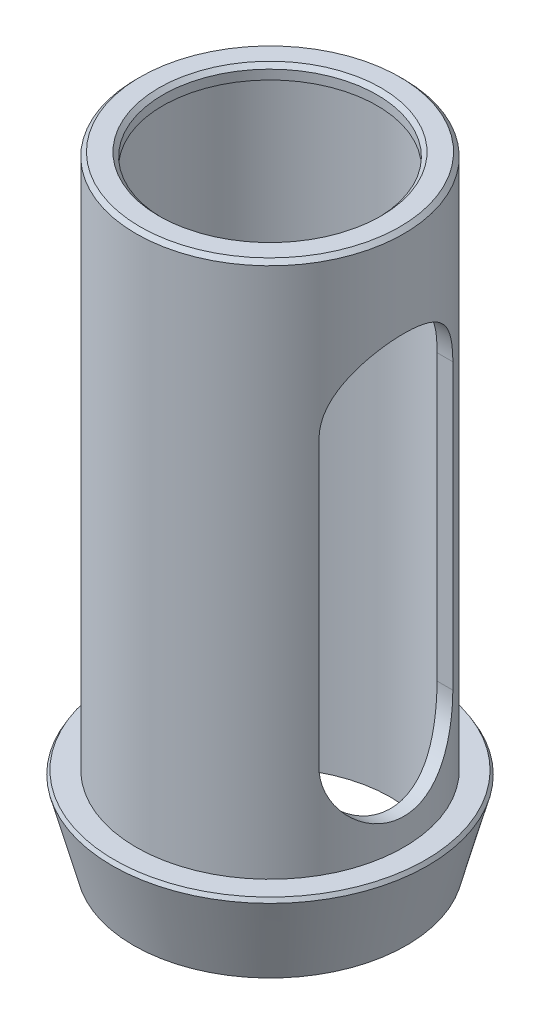
ISO-10303-21;
HEADER;
FILE_DESCRIPTION(('STEP AP214'),'2;1');
FILE_NAME('part.step','',(''),(''),'','','');
FILE_SCHEMA(('AUTOMOTIVE_DESIGN { 1 0 10303 214 1 1 1 1 }'));
ENDSEC;
DATA;
#1=APPLICATION_CONTEXT('core data for automotive mechanical design processes');
#2=APPLICATION_PROTOCOL_DEFINITION('international standard','automotive_design',2000,#1);
#3=PRODUCT_CONTEXT('',#1,'mechanical');
#4=PRODUCT('Part','Part','',(#3));
#5=PRODUCT_RELATED_PRODUCT_CATEGORY('part','',(#4));
#6=PRODUCT_DEFINITION_FORMATION('','',#4);
#7=PRODUCT_DEFINITION_CONTEXT('part definition',#1,'design');
#8=PRODUCT_DEFINITION('design','',#6,#7);
#9=PRODUCT_DEFINITION_SHAPE('','',#8);
#10=(LENGTH_UNIT() NAMED_UNIT(*) SI_UNIT(.MILLI.,.METRE.));
#11=(NAMED_UNIT(*) PLANE_ANGLE_UNIT() SI_UNIT($,.RADIAN.));
#12=(NAMED_UNIT(*) SI_UNIT($,.STERADIAN.) SOLID_ANGLE_UNIT());
#13=UNCERTAINTY_MEASURE_WITH_UNIT(LENGTH_MEASURE(1.E-05),#10,'distance_accuracy_value','');
#14=(GEOMETRIC_REPRESENTATION_CONTEXT(3) GLOBAL_UNCERTAINTY_ASSIGNED_CONTEXT((#13)) GLOBAL_UNIT_ASSIGNED_CONTEXT((#10,
#11,#12)) REPRESENTATION_CONTEXT('',''));
#15=CARTESIAN_POINT('',(0.,0.,0.));
#16=DIRECTION('',(0.,0.,1.));
#17=DIRECTION('',(1.,0.,0.));
#18=AXIS2_PLACEMENT_3D('',#15,#16,#17);
#19=CARTESIAN_POINT('',(0.,0.,0.));
#20=DIRECTION('',(0.,1.,0.));
#21=DIRECTION('',(0.,0.,1.));
#22=AXIS2_PLACEMENT_3D('',#19,#20,#21);
#23=CONICAL_SURFACE('',#22,25.908,0.26179938779915);
#24=CARTESIAN_POINT('',(0.,15.1389645203677,0.));
#25=DIRECTION('',(0.,1.,0.));
#26=DIRECTION('',(0.,0.,1.));
#27=AXIS2_PLACEMENT_3D('',#24,#25,#26);
#28=CIRCLE('',#27,29.964473317476);
#29=CARTESIAN_POINT('',(0.,15.1389645203677,-29.964473317476));
#30=VERTEX_POINT('',#29);
#31=EDGE_CURVE('E205',#30,#30,#28,.F.);
#32=ORIENTED_EDGE('',*,*,#31,.T.);
#33=EDGE_LOOP('',(#32));
#34=FACE_BOUND('',#33,.T.);
#35=CARTESIAN_POINT('',(0.,0.,0.));
#36=DIRECTION('',(0.,1.,0.));
#37=DIRECTION('',(0.,0.,1.));
#38=AXIS2_PLACEMENT_3D('',#35,#36,#37);
#39=CIRCLE('',#38,25.908);
#40=CARTESIAN_POINT('',(0.,0.,25.908));
#41=VERTEX_POINT('',#40);
#42=EDGE_CURVE('E220',#41,#41,#39,.T.);
#43=ORIENTED_EDGE('',*,*,#42,.T.);
#44=EDGE_LOOP('',(#43));
#45=FACE_BOUND('',#44,.T.);
#46=ADVANCED_FACE('F39',(#34,#45),#23,.T.);
#47=CARTESIAN_POINT('',(0.,15.875,0.));
#48=DIRECTION('',(0.,1.,0.));
#49=DIRECTION('',(0.,0.,1.));
#50=AXIS2_PLACEMENT_3D('',#47,#48,#49);
#51=PLANE('',#50);
#52=CARTESIAN_POINT('',(0.,15.875,0.));
#53=DIRECTION('',(0.,1.,0.));
#54=DIRECTION('',(0.,0.,1.));
#55=AXIS2_PLACEMENT_3D('',#52,#53,#54);
#56=CIRCLE('',#55,29.5395230351772);
#57=CARTESIAN_POINT('',(0.,15.875,-29.5395230351772));
#58=VERTEX_POINT('',#57);
#59=EDGE_CURVE('E225',#58,#58,#56,.T.);
#60=ORIENTED_EDGE('',*,*,#59,.T.);
#61=EDGE_LOOP('',(#60));
#62=FACE_BOUND('',#61,.T.);
#63=CARTESIAN_POINT('',(0.,15.875,0.));
#64=DIRECTION('',(0.,1.,0.));
#65=DIRECTION('',(0.,0.,1.));
#66=AXIS2_PLACEMENT_3D('',#63,#64,#65);
#67=CIRCLE('',#66,25.4);
#68=CARTESIAN_POINT('',(0.,15.875,25.4));
#69=VERTEX_POINT('',#68);
#70=EDGE_CURVE('E222',#69,#69,#67,.T.);
#71=ORIENTED_EDGE('',*,*,#70,.F.);
#72=EDGE_LOOP('',(#71));
#73=FACE_BOUND('',#72,.T.);
#74=ADVANCED_FACE('F142',(#62,#73),#51,.T.);
#75=CARTESIAN_POINT('',(0.,0.,0.));
#76=DIRECTION('',(0.,1.,0.));
#77=DIRECTION('',(0.,0.,1.));
#78=AXIS2_PLACEMENT_3D('',#75,#76,#77);
#79=PLANE('',#78);
#80=CARTESIAN_POINT('',(0.,0.,0.));
#81=DIRECTION('',(0.,-1.,0.));
#82=DIRECTION('',(0.,0.,-1.));
#83=AXIS2_PLACEMENT_3D('',#80,#81,#82);
#84=CIRCLE('',#83,22.86);
#85=CARTESIAN_POINT('',(0.,0.,-22.86));
#86=VERTEX_POINT('',#85);
#87=EDGE_CURVE('E213',#86,#86,#84,.T.);
#88=ORIENTED_EDGE('',*,*,#87,.F.);
#89=EDGE_LOOP('',(#88));
#90=FACE_BOUND('',#89,.T.);
#91=ORIENTED_EDGE('',*,*,#42,.F.);
#92=EDGE_LOOP('',(#91));
#93=FACE_BOUND('',#92,.T.);
#94=ADVANCED_FACE('F140',(#90,#93),#79,.F.);
#95=CARTESIAN_POINT('',(0.,117.475,0.));
#96=DIRECTION('',(0.,-1.,0.));
#97=DIRECTION('',(0.,0.,-1.));
#98=AXIS2_PLACEMENT_3D('',#95,#96,#97);
#99=CYLINDRICAL_SURFACE('',#98,25.4);
#100=DIRECTION('',(0.,-1.,0.));
#101=VECTOR('',#100,1.);
#102=CARTESIAN_POINT('',(21.9970452561247,117.475,-12.7));
#103=LINE('',#102,#101);
#104=CARTESIAN_POINT('',(21.9970452561247,87.63,-12.7));
#105=VERTEX_POINT('',#104);
#106=CARTESIAN_POINT('',(21.9970452561247,33.655,-12.7));
#107=VERTEX_POINT('',#106);
#108=EDGE_CURVE('E132',#105,#107,#103,.T.);
#109=ORIENTED_EDGE('',*,*,#108,.T.);
#110=CARTESIAN_POINT('',(21.9970452561247,33.655,-12.7));
#111=CARTESIAN_POINT('',(21.9970414396094,33.4886967395995,-12.7000012350209));
#112=CARTESIAN_POINT('',(21.9989319888934,33.3224169785993,-12.6967327347774));
#113=CARTESIAN_POINT('',(22.006462703468,32.990205447678,-12.683677781512));
#114=CARTESIAN_POINT('',(22.0121027101483,32.8242736633345,-12.6738916042023));
#115=CARTESIAN_POINT('',(22.0345757611602,32.3277118669053,-12.6348105505561));
#116=CARTESIAN_POINT('',(22.0569619679057,31.9980319961614,-12.5957930726223));
#117=CARTESIAN_POINT('',(22.1155380915001,31.3458913728344,-12.4926552461168));
#118=CARTESIAN_POINT('',(22.1516481575131,31.0234000740164,-12.4286800554354));
#119=CARTESIAN_POINT('',(22.2363984092014,30.3858645471533,-12.2764069103784));
#120=CARTESIAN_POINT('',(22.2850400340891,30.0708211790212,-12.1881061622036));
#121=CARTESIAN_POINT('',(22.3931170114,29.4508723777069,-11.9883758640728));
#122=CARTESIAN_POINT('',(22.4525284377125,29.1459462100245,-11.8769975062509));
#123=CARTESIAN_POINT('',(22.5804045585334,28.5471387835711,-11.6320421542612));
#124=CARTESIAN_POINT('',(22.6488691370672,28.253257383374,-11.4984654444575));
#125=CARTESIAN_POINT('',(22.7930331560059,27.6775298058626,-11.2099804732541));
#126=CARTESIAN_POINT('',(22.8687418055359,27.3956996250638,-11.0550449459176));
#127=CARTESIAN_POINT('',(23.0253996292901,26.8455507002946,-10.7249408659039));
#128=CARTESIAN_POINT('',(23.1063507283755,26.5772369841667,-10.5497648628401));
#129=CARTESIAN_POINT('',(23.2782885558474,26.0339477074241,-10.1650971801861));
#130=CARTESIAN_POINT('',(23.3695550628471,25.7602164200412,-9.95397156155212));
#131=CARTESIAN_POINT('',(23.5535559117077,25.2311334051046,-9.51039733322313));
#132=CARTESIAN_POINT('',(23.6462903283373,24.975782617471,-9.27794763446337));
#133=CARTESIAN_POINT('',(23.8309606049041,24.4845855602846,-8.79276468755069));
#134=CARTESIAN_POINT('',(23.9228961087944,24.2487476242533,-8.5400228629343));
#135=CARTESIAN_POINT('',(24.103671050886,23.7980451364015,-8.01560599452959));
#136=CARTESIAN_POINT('',(24.1925115183395,23.5831735685856,-7.74393733676476));
#137=CARTESIAN_POINT('',(24.3708514078877,23.161798416835,-7.16378462553701));
#138=CARTESIAN_POINT('',(24.4599862532057,22.9568527722448,-6.85405330892021));
#139=CARTESIAN_POINT('',(24.6298463592293,22.5739905425763,-6.21607806310032));
#140=CARTESIAN_POINT('',(24.7105711350025,22.3960755158378,-5.88783306806153));
#141=CARTESIAN_POINT('',(24.8612501700202,22.0691117798188,-5.21507342298949));
#142=CARTESIAN_POINT('',(24.9312095664927,21.9200492933236,-4.87056663627276));
#143=CARTESIAN_POINT('',(25.0583001324898,21.6524049207068,-4.16762566461531));
#144=CARTESIAN_POINT('',(25.1154326656043,21.5338197944235,-3.80919296485829));
#145=CARTESIAN_POINT('',(25.2115393699809,21.335964234711,-3.10720530462334));
#146=CARTESIAN_POINT('',(25.2515162644623,21.2544969238466,-2.76440621955987));
#147=CARTESIAN_POINT('',(25.3177415644942,21.1201900167496,-2.07193150973685));
#148=CARTESIAN_POINT('',(25.3439905665485,21.067349176637,-1.72225618444863));
#149=CARTESIAN_POINT('',(25.3819883248125,20.991018511182,-1.01910581528698));
#150=CARTESIAN_POINT('',(25.3937442340291,20.9675142068407,-0.665632732745787));
#151=CARTESIAN_POINT('',(25.4024303210946,20.9501375474038,0.0422142786452658));
#152=CARTESIAN_POINT('',(25.3993614058484,20.956263379692,0.396588151063987));
#153=CARTESIAN_POINT('',(25.3794054750907,20.9962293954721,1.07234709635932));
#154=CARTESIAN_POINT('',(25.3637450461772,21.0276096912033,1.39391757271056));
#155=CARTESIAN_POINT('',(25.3205396897996,21.1146188699675,2.03292949194426));
#156=CARTESIAN_POINT('',(25.2929955991071,21.1702460456928,2.35037122392562));
#157=CARTESIAN_POINT('',(25.2266832381143,21.3051420225889,2.97898616813181));
#158=CARTESIAN_POINT('',(25.1879148162447,21.384411143012,3.29015929564709));
#159=CARTESIAN_POINT('',(25.1000563890435,21.565784918051,3.9042796718663));
#160=CARTESIAN_POINT('',(25.0509660136199,21.6678903914688,4.20722662518229));
#161=CARTESIAN_POINT('',(24.9428274660593,21.8955437872797,4.80724125102716));
#162=CARTESIAN_POINT('',(24.8836515476992,22.0213949971317,5.1041706297326));
#163=CARTESIAN_POINT('',(24.7571406199773,22.2945134349376,5.68618399676862));
#164=CARTESIAN_POINT('',(24.6898056184941,22.4417806422115,5.97126799653717));
#165=CARTESIAN_POINT('',(24.5484088809431,22.7566439507374,6.5282613154405));
#166=CARTESIAN_POINT('',(24.4743464246001,22.9242422293818,6.80016921908602));
#167=CARTESIAN_POINT('',(24.3210101619422,23.2787251888179,7.32969899033001));
#168=CARTESIAN_POINT('',(24.2417343350664,23.4656173635815,7.58731524670746));
#169=CARTESIAN_POINT('',(24.0719582547907,23.876078356657,8.11070119879699));
#170=CARTESIAN_POINT('',(23.9811044919939,24.1014438435616,8.37494897323532));
#171=CARTESIAN_POINT('',(23.7973153531037,24.572639144061,8.88374730168019));
#172=CARTESIAN_POINT('',(23.7043798596802,24.8184701132581,9.12829674186609));
#173=CARTESIAN_POINT('',(23.5186440423044,25.3295373896343,9.59671363450685));
#174=CARTESIAN_POINT('',(23.4258438807355,25.5947887111984,9.82056477545915));
#175=CARTESIAN_POINT('',(23.2428119048125,26.1433317353761,10.2462378392843));
#176=CARTESIAN_POINT('',(23.1525805590904,26.4266266995812,10.4480557614082));
#177=CARTESIAN_POINT('',(22.9714870845077,27.0287735055655,10.840686980241));
#178=CARTESIAN_POINT('',(22.8809598714528,27.3487401685464,11.0299501377058));
#179=CARTESIAN_POINT('',(22.708667440824,28.0057540486414,11.3804465907303));
#180=CARTESIAN_POINT('',(22.6268981618383,28.3427932407792,11.5416929006237));
#181=CARTESIAN_POINT('',(22.4752063655018,29.0314212732109,11.8343668019548));
#182=CARTESIAN_POINT('',(22.4052627094047,29.3829827236232,11.9658477458782));
#183=CARTESIAN_POINT('',(22.2798931926841,30.0986612473836,12.1976959096641));
#184=CARTESIAN_POINT('',(22.2244610431641,30.4627728041739,12.298076611007));
#185=CARTESIAN_POINT('',(22.1482172920287,31.0616067464089,12.4346302912662));
#186=CARTESIAN_POINT('',(22.1222274631262,31.2934554138166,12.4807502415202));
#187=CARTESIAN_POINT('',(22.0773004159581,31.759989083927,12.5600511687931));
#188=CARTESIAN_POINT('',(22.0583612442299,31.9946732823819,12.5932357298248));
#189=CARTESIAN_POINT('',(22.0278759769331,32.4664125000555,12.6464886716762));
#190=CARTESIAN_POINT('',(22.0163426608123,32.703470904332,12.6665343814947));
#191=CARTESIAN_POINT('',(22.0009124396745,33.1786821945023,12.6933010542399));
#192=CARTESIAN_POINT('',(21.9970186568584,33.4168354880279,12.7000165692625));
#193=CARTESIAN_POINT('',(21.9970452561247,33.655,12.7));
#194=B_SPLINE_CURVE_WITH_KNOTS('',3,(#110,#111,#112,#113,#114,#115,#116,#117,#118,#119,#120,
#121,#122,#123,#124,#125,#126,#127,#128,#129,#130,#131,#132,#133,#134,#135,#136,#137,#138,#139,
#140,#141,#142,#143,#144,#145,#146,#147,#148,#149,#150,#151,#152,#153,#154,#155,#156,#157,#158,
#159,#160,#161,#162,#163,#164,#165,#166,#167,#168,#169,#170,#171,#172,#173,#174,#175,#176,#177,
#178,#179,#180,#181,#182,#183,#184,#185,#186,#187,#188,#189,#190,#191,#192,#193),.UNSPECIFIED.,
.F.,.F.,(4,2,2,2,2,2,2,2,2,2,2,2,2,2,2,2,2,2,2,2,2,2,2,2,2,2,2,2,2,2,2,2,2,2,2,2,2,2,2,2,2,4),
(0.,0.498820505600281,0.997619911328922,1.99437162090113,2.98541048473554,3.97656321723111,
4.96554041251341,5.95450493982985,6.94474384222078,7.93534841329295,9.00682090830906,
10.0783481561324,11.1503306932051,12.2219532726314,13.3663135412443,14.5107397582568,
15.6546181512656,16.7983748839493,17.8607557108744,18.9230903714288,19.9849005108661,
21.0466456951537,22.0159315145833,22.9851490942291,23.9543797624329,24.9236451881631,
25.9062501380334,26.8888541390727,27.8715634669,28.8546559367994,29.9304525828082,
31.0063100159159,32.0830081893414,33.1599015434971,34.3062756798749,35.4521158727002,
36.5958856666975,37.7391589579934,38.4521864887518,39.1650163200538,39.8790729189734,
40.5934212849452),.UNSPECIFIED.);
#195=CARTESIAN_POINT('',(21.9970452561247,33.655,12.7));
#196=VERTEX_POINT('',#195);
#197=EDGE_CURVE('E124',#107,#196,#194,.T.);
#198=ORIENTED_EDGE('',*,*,#197,.T.);
#199=DIRECTION('',(0.,-1.,0.));
#200=VECTOR('',#199,1.);
#201=CARTESIAN_POINT('',(21.9970452561247,117.475,12.7));
#202=LINE('',#201,#200);
#203=CARTESIAN_POINT('',(21.9970452561247,87.63,12.7));
#204=VERTEX_POINT('',#203);
#205=EDGE_CURVE('E133',#196,#204,#202,.F.);
#206=ORIENTED_EDGE('',*,*,#205,.T.);
#207=CARTESIAN_POINT('',(21.9970452561247,87.63,12.7));
#208=CARTESIAN_POINT('',(21.9970414396094,87.7963032604005,12.7000012350209));
#209=CARTESIAN_POINT('',(21.9989319888934,87.9625830214007,12.6967327347774));
#210=CARTESIAN_POINT('',(22.006462703468,88.2947945523221,12.683677781512));
#211=CARTESIAN_POINT('',(22.0121027101483,88.4607263366656,12.6738916042023));
#212=CARTESIAN_POINT('',(22.0345757611602,88.9572881330947,12.6348105505561));
#213=CARTESIAN_POINT('',(22.0569619679057,89.2869680038386,12.5957930726223));
#214=CARTESIAN_POINT('',(22.1155380915001,89.9391086271656,12.4926552461168));
#215=CARTESIAN_POINT('',(22.1516481575131,90.2615999259836,12.4286800554354));
#216=CARTESIAN_POINT('',(22.2363984092014,90.8991354528467,12.2764069103784));
#217=CARTESIAN_POINT('',(22.2850400340891,91.2141788209788,12.1881061622036));
#218=CARTESIAN_POINT('',(22.3931170114,91.8341276222931,11.9883758640728));
#219=CARTESIAN_POINT('',(22.4525284377125,92.1390537899755,11.8769975062509));
#220=CARTESIAN_POINT('',(22.5804045585334,92.7378612164289,11.6320421542612));
#221=CARTESIAN_POINT('',(22.6488691370672,93.031742616626,11.4984654444575));
#222=CARTESIAN_POINT('',(22.7930331560058,93.6074701941374,11.2099804732541));
#223=CARTESIAN_POINT('',(22.8687418055359,93.8893003749362,11.0550449459176));
#224=CARTESIAN_POINT('',(23.0253996292901,94.4394492997054,10.7249408659039));
#225=CARTESIAN_POINT('',(23.1063507283755,94.7077630158333,10.5497648628401));
#226=CARTESIAN_POINT('',(23.2782885558473,95.2510522925759,10.1650971801861));
#227=CARTESIAN_POINT('',(23.3695550628471,95.5247835799588,9.95397156155212));
#228=CARTESIAN_POINT('',(23.5535559117077,96.0538665948954,9.51039733322314));
#229=CARTESIAN_POINT('',(23.6462903283373,96.3092173825291,9.27794763446337));
#230=CARTESIAN_POINT('',(23.8309606049041,96.8004144397154,8.79276468755069));
#231=CARTESIAN_POINT('',(23.9228961087944,97.0362523757467,8.54002286293431));
#232=CARTESIAN_POINT('',(24.103671050886,97.4869548635985,8.01560599452959));
#233=CARTESIAN_POINT('',(24.1925115183395,97.7018264314145,7.74393733676477));
#234=CARTESIAN_POINT('',(24.3708514078877,98.123201583165,7.16378462553702));
#235=CARTESIAN_POINT('',(24.4599862532057,98.3281472277552,6.85405330892022));
#236=CARTESIAN_POINT('',(24.6298463592293,98.7110094574237,6.21607806310033));
#237=CARTESIAN_POINT('',(24.7105711350025,98.8889244841622,5.88783306806154));
#238=CARTESIAN_POINT('',(24.8612501700202,99.2158882201813,5.2150734229895));
#239=CARTESIAN_POINT('',(24.9312095664927,99.3649507066764,4.87056663627276));
#240=CARTESIAN_POINT('',(25.0583001324898,99.6325950792932,4.16762566461531));
#241=CARTESIAN_POINT('',(25.1154326656043,99.7511802055765,3.8091929648583));
#242=CARTESIAN_POINT('',(25.2115393699809,99.949035765289,3.10720530462335));
#243=CARTESIAN_POINT('',(25.2515162644623,100.030503076153,2.76440621955988));
#244=CARTESIAN_POINT('',(25.3177415644942,100.16480998325,2.07193150973686));
#245=CARTESIAN_POINT('',(25.3439905665485,100.217650823363,1.72225618444864));
#246=CARTESIAN_POINT('',(25.3819883248125,100.293981488818,1.01910581528699));
#247=CARTESIAN_POINT('',(25.3937442340291,100.317485793159,0.665632732745793));
#248=CARTESIAN_POINT('',(25.4024303210946,100.334862452596,-0.0422142786452605));
#249=CARTESIAN_POINT('',(25.3993614058484,100.328736620308,-0.396588151063981));
#250=CARTESIAN_POINT('',(25.3794054750907,100.288770604528,-1.07234709635932));
#251=CARTESIAN_POINT('',(25.3637450461772,100.257390308797,-1.39391757271055));
#252=CARTESIAN_POINT('',(25.3205396897996,100.170381130033,-2.03292949194426));
#253=CARTESIAN_POINT('',(25.2929955991071,100.114753954307,-2.35037122392562));
#254=CARTESIAN_POINT('',(25.2266832381143,99.9798579774111,-2.97898616813181));
#255=CARTESIAN_POINT('',(25.1879148162447,99.900588856988,-3.29015929564709));
#256=CARTESIAN_POINT('',(25.1000563890435,99.719215081949,-3.9042796718663));
#257=CARTESIAN_POINT('',(25.0509660136199,99.6171096085312,-4.20722662518229));
#258=CARTESIAN_POINT('',(24.9428274660593,99.3894562127203,-4.80724125102716));
#259=CARTESIAN_POINT('',(24.8836515476992,99.2636050028683,-5.1041706297326));
#260=CARTESIAN_POINT('',(24.7571406199773,98.9904865650624,-5.68618399676862));
#261=CARTESIAN_POINT('',(24.6898056184941,98.8432193577885,-5.97126799653717));
#262=CARTESIAN_POINT('',(24.5484088809431,98.5283560492626,-6.5282613154405));
#263=CARTESIAN_POINT('',(24.4743464246001,98.3607577706182,-6.80016921908601));
#264=CARTESIAN_POINT('',(24.3210101619422,98.0062748111821,-7.32969899033001));
#265=CARTESIAN_POINT('',(24.2417343350664,97.8193826364185,-7.58731524670746));
#266=CARTESIAN_POINT('',(24.0719582547907,97.408921643343,-8.11070119879699));
#267=CARTESIAN_POINT('',(23.9811044919939,97.1835561564384,-8.37494897323532));
#268=CARTESIAN_POINT('',(23.7973153531037,96.712360855939,-8.8837473016802));
#269=CARTESIAN_POINT('',(23.7043798596802,96.4665298867419,-9.1282967418661));
#270=CARTESIAN_POINT('',(23.5186440423044,95.9554626103657,-9.59671363450686));
#271=CARTESIAN_POINT('',(23.4258438807355,95.6902112888016,-9.82056477545915));
#272=CARTESIAN_POINT('',(23.2428119048125,95.1416682646239,-10.2462378392843));
#273=CARTESIAN_POINT('',(23.1525805590904,94.8583733004188,-10.4480557614082));
#274=CARTESIAN_POINT('',(22.9714870845077,94.2562264944345,-10.840686980241));
#275=CARTESIAN_POINT('',(22.8809598714528,93.9362598314536,-11.0299501377058));
#276=CARTESIAN_POINT('',(22.708667440824,93.2792459513586,-11.3804465907303));
#277=CARTESIAN_POINT('',(22.6268981618383,92.9422067592209,-11.5416929006237));
#278=CARTESIAN_POINT('',(22.4752063655018,92.2535787267891,-11.8343668019548));
#279=CARTESIAN_POINT('',(22.4052627094047,91.9020172763768,-11.9658477458782));
#280=CARTESIAN_POINT('',(22.2798931926841,91.1863387526164,-12.1976959096641));
#281=CARTESIAN_POINT('',(22.2244610431641,90.8222271958262,-12.298076611007));
#282=CARTESIAN_POINT('',(22.1482172920287,90.2233932535911,-12.4346302912662));
#283=CARTESIAN_POINT('',(22.1222274631262,89.9915445861835,-12.4807502415202));
#284=CARTESIAN_POINT('',(22.0773004159581,89.525010916073,-12.5600511687931));
#285=CARTESIAN_POINT('',(22.0583612442299,89.2903267176182,-12.5932357298248));
#286=CARTESIAN_POINT('',(22.0278759769331,88.8185874999445,-12.6464886716762));
#287=CARTESIAN_POINT('',(22.0163426608123,88.581529095668,-12.6665343814947));
#288=CARTESIAN_POINT('',(22.0009124396745,88.1063178054977,-12.6933010542399));
#289=CARTESIAN_POINT('',(21.9970186568584,87.8681645119721,-12.7000165692625));
#290=CARTESIAN_POINT('',(21.9970452561247,87.63,-12.7));
#291=B_SPLINE_CURVE_WITH_KNOTS('',3,(#207,#208,#209,#210,#211,#212,#213,#214,#215,#216,#217,
#218,#219,#220,#221,#222,#223,#224,#225,#226,#227,#228,#229,#230,#231,#232,#233,#234,#235,#236,
#237,#238,#239,#240,#241,#242,#243,#244,#245,#246,#247,#248,#249,#250,#251,#252,#253,#254,#255,
#256,#257,#258,#259,#260,#261,#262,#263,#264,#265,#266,#267,#268,#269,#270,#271,#272,#273,#274,
#275,#276,#277,#278,#279,#280,#281,#282,#283,#284,#285,#286,#287,#288,#289,#290),.UNSPECIFIED.,
.F.,.F.,(4,2,2,2,2,2,2,2,2,2,2,2,2,2,2,2,2,2,2,2,2,2,2,2,2,2,2,2,2,2,2,2,2,2,2,2,2,2,2,2,2,4),
(0.,0.498820505600302,0.997619911328936,1.99437162090113,2.98541048473554,3.97656321723111,
4.96554041251339,5.95450493982984,6.94474384222079,7.93534841329296,9.00682090830907,
10.0783481561324,11.1503306932051,12.2219532726314,13.3663135412443,14.5107397582568,
15.6546181512656,16.7983748839493,17.8607557108744,18.9230903714288,19.9849005108661,
21.0466456951537,22.0159315145833,22.9851490942291,23.9543797624329,24.9236451881631,
25.9062501380334,26.8888541390727,27.8715634669,28.8546559367995,29.9304525828083,
31.0063100159159,32.0830081893414,33.1599015434971,34.3062756798749,35.4521158727002,
36.5958856666975,37.7391589579934,38.4521864887518,39.1650163200538,39.8790729189734,
40.5934212849452),.UNSPECIFIED.);
#292=EDGE_CURVE('E96',#204,#105,#291,.T.);
#293=ORIENTED_EDGE('',*,*,#292,.T.);
#294=EDGE_LOOP('',(#109,#198,#206,#293));
#295=FACE_BOUND('',#294,.T.);
#296=CARTESIAN_POINT('',(0.,116.713,0.));
#297=DIRECTION('',(0.,1.,0.));
#298=DIRECTION('',(0.,0.,1.));
#299=AXIS2_PLACEMENT_3D('',#296,#297,#298);
#300=CIRCLE('',#299,25.4);
#301=CARTESIAN_POINT('',(0.,116.713,25.4));
#302=VERTEX_POINT('',#301);
#303=EDGE_CURVE('E196',#302,#302,#300,.F.);
#304=ORIENTED_EDGE('',*,*,#303,.T.);
#305=EDGE_LOOP('',(#304));
#306=FACE_BOUND('',#305,.T.);
#307=ORIENTED_EDGE('',*,*,#70,.T.);
#308=EDGE_LOOP('',(#307));
#309=FACE_BOUND('',#308,.T.);
#310=ADVANCED_FACE('F135',(#295,#306,#309),#99,.T.);
#311=CARTESIAN_POINT('',(0.,117.475,0.));
#312=DIRECTION('',(0.,1.,0.));
#313=DIRECTION('',(0.,0.,1.));
#314=AXIS2_PLACEMENT_3D('',#311,#312,#313);
#315=PLANE('',#314);
#316=CARTESIAN_POINT('',(0.,117.475,0.));
#317=DIRECTION('',(0.,1.,0.));
#318=DIRECTION('',(0.,0.,1.));
#319=AXIS2_PLACEMENT_3D('',#316,#317,#318);
#320=CIRCLE('',#319,24.638);
#321=CARTESIAN_POINT('',(0.,117.475,24.638));
#322=VERTEX_POINT('',#321);
#323=EDGE_CURVE('E199',#322,#322,#320,.T.);
#324=ORIENTED_EDGE('',*,*,#323,.T.);
#325=EDGE_LOOP('',(#324));
#326=FACE_BOUND('',#325,.T.);
#327=CARTESIAN_POINT('',(0.,117.475,0.));
#328=DIRECTION('',(0.,1.,0.));
#329=DIRECTION('',(0.,0.,1.));
#330=AXIS2_PLACEMENT_3D('',#327,#328,#329);
#331=CIRCLE('',#330,21.082);
#332=CARTESIAN_POINT('',(0.,117.475,21.082));
#333=VERTEX_POINT('',#332);
#334=EDGE_CURVE('E201',#333,#333,#331,.F.);
#335=ORIENTED_EDGE('',*,*,#334,.T.);
#336=EDGE_LOOP('',(#335));
#337=FACE_BOUND('',#336,.T.);
#338=ADVANCED_FACE('F139',(#326,#337),#315,.T.);
#339=CARTESIAN_POINT('',(0.,114.935,0.));
#340=DIRECTION('',(0.,-1.,0.));
#341=DIRECTION('',(0.,0.,-1.));
#342=AXIS2_PLACEMENT_3D('',#339,#340,#341);
#343=CYLINDRICAL_SURFACE('',#342,22.86);
#344=DIRECTION('',(0.,-1.,0.));
#345=VECTOR('',#344,1.);
#346=CARTESIAN_POINT('',(19.0076195248116,114.935,-12.7));
#347=LINE('',#346,#345);
#348=CARTESIAN_POINT('',(19.0076195248116,33.655,-12.7));
#349=VERTEX_POINT('',#348);
#350=CARTESIAN_POINT('',(19.0076195248116,87.63,-12.7));
#351=VERTEX_POINT('',#350);
#352=EDGE_CURVE('E54',#349,#351,#347,.F.);
#353=ORIENTED_EDGE('',*,*,#352,.T.);
#354=CARTESIAN_POINT('',(19.0076195248116,87.63,-12.7));
#355=CARTESIAN_POINT('',(19.00761483662,87.7932823301981,-12.700001584447));
#356=CARTESIAN_POINT('',(19.0097244377594,87.9565404998124,-12.6968503013551));
#357=CARTESIAN_POINT('',(19.0181246727883,88.282697962647,-12.6842665384097));
#358=CARTESIAN_POINT('',(19.0244150738237,88.4455972753474,-12.6748344083746));
#359=CARTESIAN_POINT('',(19.0494692549088,88.9329825414645,-12.6371789748512));
#360=CARTESIAN_POINT('',(19.0744162080383,89.2564944179449,-12.5995965172014));
#361=CARTESIAN_POINT('',(19.1395704340138,89.8958542910126,-12.5003960255619));
#362=CARTESIAN_POINT('',(19.1796708009284,90.2117398522535,-12.4389462903776));
#363=CARTESIAN_POINT('',(19.2736366096781,90.8360447687846,-12.2928459855793));
#364=CARTESIAN_POINT('',(19.3275042164903,91.1444629414268,-12.2081917667754));
#365=CARTESIAN_POINT('',(19.4469592716907,91.7510212815575,-12.0169889640033));
#366=CARTESIAN_POINT('',(19.5125113623148,92.0491893065662,-11.9105062919381));
#367=CARTESIAN_POINT('',(19.6534043663724,92.634745904318,-11.6765546767588));
#368=CARTESIAN_POINT('',(19.7287450719362,92.9221347058002,-11.5490861792813));
#369=CARTESIAN_POINT('',(19.8872581699754,93.4854799792954,-11.2739435752657));
#370=CARTESIAN_POINT('',(19.9704443810653,93.7614149985566,-11.1262336012613));
#371=CARTESIAN_POINT('',(20.1424458082365,94.3003645394853,-10.8117344145421));
#372=CARTESIAN_POINT('',(20.2312615870442,94.5633777648235,-10.6449432931487));
#373=CARTESIAN_POINT('',(20.4217786459632,95.1018950672271,-10.2751219201982));
#374=CARTESIAN_POINT('',(20.5238675638986,95.3759161327677,-10.0701295049867));
#375=CARTESIAN_POINT('',(20.7298033560326,95.9061612721025,-9.63908244358872));
#376=CARTESIAN_POINT('',(20.8336503356082,96.1623842743602,-9.41302653118476));
#377=CARTESIAN_POINT('',(21.040657293371,96.6560678048159,-8.9407404009603));
#378=CARTESIAN_POINT('',(21.14381693154,96.8935195989472,-8.69450089918137));
#379=CARTESIAN_POINT('',(21.3469763232167,97.3482904154831,-8.18302524023943));
#380=CARTESIAN_POINT('',(21.4469770966528,97.5656159809056,-7.91779530692088));
#381=CARTESIAN_POINT('',(21.6501979034937,97.9972989910325,-7.34498841855679));
#382=CARTESIAN_POINT('',(21.7529171989712,98.209684711023,-7.03574187147116));
#383=CARTESIAN_POINT('',(21.9491060668201,98.6074124387357,-6.39748419209666));
#384=CARTESIAN_POINT('',(22.0425749462996,98.7927524211202,-6.06847158221519));
#385=CARTESIAN_POINT('',(22.2175251361006,99.1343616278138,-5.39285210919598));
#386=CARTESIAN_POINT('',(22.2990132545922,99.290647375898,-5.04625539018431));
#387=CARTESIAN_POINT('',(22.4475923747497,99.5723252195945,-4.33775679391504));
#388=CARTESIAN_POINT('',(22.5146853399916,99.6977215290374,-3.97585701214914));
#389=CARTESIAN_POINT('',(22.6273644987088,99.906606895604,-3.27084728969866));
#390=CARTESIAN_POINT('',(22.6742891601997,99.992742174942,-2.92873452248758));
#391=CARTESIAN_POINT('',(22.7529635105635,100.136453332998,-2.23683560977155));
#392=CARTESIAN_POINT('',(22.7847139813972,100.194030683378,-1.88704986064476));
#393=CARTESIAN_POINT('',(22.8320922748306,100.27974755248,-1.18302947935733));
#394=CARTESIAN_POINT('',(22.8477303867168,100.307905858246,-0.828797832820891));
#395=CARTESIAN_POINT('',(22.8624467127318,100.33440866312,-0.118888583254713));
#396=CARTESIAN_POINT('',(22.8615262755495,100.332755590356,0.236788899652854));
#397=CARTESIAN_POINT('',(22.8441462281376,100.301446010593,0.908342083651929));
#398=CARTESIAN_POINT('',(22.8293586509991,100.274802640927,1.22440718295471));
#399=CARTESIAN_POINT('',(22.7869680820727,100.198108032331,1.85278884348767));
#400=CARTESIAN_POINT('',(22.7593662132445,100.14805884453,2.16510573072657));
#401=CARTESIAN_POINT('',(22.6919927316159,100.025143075819,2.78387094011094));
#402=CARTESIAN_POINT('',(22.652220877434,99.9522760423364,3.09031914572791));
#403=CARTESIAN_POINT('',(22.5614077048807,99.7845254149437,3.69541518606704));
#404=CARTESIAN_POINT('',(22.5103659454772,99.6896409594054,3.99406271500895));
#405=CARTESIAN_POINT('',(22.3975473798864,99.4777277797897,4.58484923907195));
#406=CARTESIAN_POINT('',(22.3356661147757,99.360482489258,4.87689042221976));
#407=CARTESIAN_POINT('',(22.2028431506574,99.1055599908174,5.44975435780948));
#408=CARTESIAN_POINT('',(22.1319014972798,98.9678828858069,5.73057716674008));
#409=CARTESIAN_POINT('',(21.9823843669155,98.6731764542465,6.27975933223377));
#410=CARTESIAN_POINT('',(21.9038084975974,98.5161461330004,6.54811804720367));
#411=CARTESIAN_POINT('',(21.7405209766762,98.1837488121627,7.07138652388216));
#412=CARTESIAN_POINT('',(21.6558071247106,98.0083752267293,7.32629140545375));
#413=CARTESIAN_POINT('',(21.4723728499854,97.6202727978841,7.84866519594726));
#414=CARTESIAN_POINT('',(21.3731320892456,97.4055558239894,8.11447609114786));
#415=CARTESIAN_POINT('',(21.1713426650413,96.956117718321,8.62727017039818));
#416=CARTESIAN_POINT('',(21.0687937577163,96.7213951097238,8.87425196192236));
#417=CARTESIAN_POINT('',(20.8626157073736,96.2328044991342,9.3486814014627));
#418=CARTESIAN_POINT('',(20.7589853996935,95.9789135023518,9.57610486455876));
#419=CARTESIAN_POINT('',(20.5532325410071,95.4533142718151,10.0100904990333));
#420=CARTESIAN_POINT('',(20.4511100086788,95.1816058175687,10.2166524121683));
#421=CARTESIAN_POINT('',(20.2417571986125,94.595681015818,10.6258369844448));
#422=CARTESIAN_POINT('',(20.1349182026543,94.2798519592611,10.826358618347));
#423=CARTESIAN_POINT('',(19.929614079419,93.6295886199943,11.1997997627666));
#424=CARTESIAN_POINT('',(19.8311501941985,93.2951515897832,11.3727151825142));
#425=CARTESIAN_POINT('',(19.6465040243374,92.6103537285334,11.6887942548522));
#426=CARTESIAN_POINT('',(19.5602898858514,92.260037442746,11.8320355330379));
#427=CARTESIAN_POINT('',(19.4034761289452,91.5449413281171,12.0874823950244));
#428=CARTESIAN_POINT('',(19.3328701274209,91.180167484082,12.1997006707151));
#429=CARTESIAN_POINT('',(19.2293837255128,90.552973407566,12.3618999474148));
#430=CARTESIAN_POINT('',(19.1915773675609,90.2935372978209,12.4204098411769));
#431=CARTESIAN_POINT('',(19.1259838120257,89.7703251809547,12.521180029964));
#432=CARTESIAN_POINT('',(19.098193715868,89.5065504525146,12.5634450262841));
#433=CARTESIAN_POINT('',(19.053292018649,88.9748566389352,12.6314460648737));
#434=CARTESIAN_POINT('',(19.0362249695056,88.7069249411585,12.6571131592212));
#435=CARTESIAN_POINT('',(19.0133572237085,88.1693379657131,12.6914113442716));
#436=CARTESIAN_POINT('',(19.0075632570725,87.8996817548188,12.7000322584738));
#437=CARTESIAN_POINT('',(19.0076195248116,87.63,12.7));
#438=B_SPLINE_CURVE_WITH_KNOTS('',3,(#354,#355,#356,#357,#358,#359,#360,#361,#362,#363,#364,
#365,#366,#367,#368,#369,#370,#371,#372,#373,#374,#375,#376,#377,#378,#379,#380,#381,#382,#383,
#384,#385,#386,#387,#388,#389,#390,#391,#392,#393,#394,#395,#396,#397,#398,#399,#400,#401,#402,
#403,#404,#405,#406,#407,#408,#409,#410,#411,#412,#413,#414,#415,#416,#417,#418,#419,#420,#421,
#422,#423,#424,#425,#426,#427,#428,#429,#430,#431,#432,#433,#434,#435,#436,#437),.UNSPECIFIED.,
.F.,.F.,(4,2,2,2,2,2,2,2,2,2,2,2,2,2,2,2,2,2,2,2,2,2,2,2,2,2,2,2,2,2,2,2,2,2,2,2,2,2,2,2,2,4),
(0.,0.489755388049794,0.979483500940286,1.95792786339552,2.9295945004439,3.90141403175211,
4.87034123177275,5.83924785915851,6.80989412065721,7.78063756051272,8.85088316669036,
9.92119315150134,10.9919982456526,12.0624539909764,13.2278231191009,14.3932794719106,
15.558070962952,16.7227034690518,17.788900890655,18.8550433627307,19.9205045778056,
20.985879011767,21.937339388242,22.8887164007626,23.8401122842705,24.7915454059319,
25.7527098292097,26.7138694120559,27.6750784161862,28.6366337186866,29.7029754669885,
30.7693960013316,31.8371168091494,32.9048508325756,34.0705685275376,35.2364588019626,
36.399259559712,37.5615838950601,38.3668157225739,39.1718143391393,39.9801358081708,
40.7889396963379),.UNSPECIFIED.);
#439=CARTESIAN_POINT('',(19.0076195248116,87.63,12.7));
#440=VERTEX_POINT('',#439);
#441=EDGE_CURVE('E11',#351,#440,#438,.T.);
#442=ORIENTED_EDGE('',*,*,#441,.T.);
#443=DIRECTION('',(0.,-1.,0.));
#444=VECTOR('',#443,1.);
#445=CARTESIAN_POINT('',(19.0076195248116,114.935,12.7));
#446=LINE('',#445,#444);
#447=CARTESIAN_POINT('',(19.0076195248116,33.655,12.7));
#448=VERTEX_POINT('',#447);
#449=EDGE_CURVE('E85',#440,#448,#446,.T.);
#450=ORIENTED_EDGE('',*,*,#449,.T.);
#451=CARTESIAN_POINT('',(19.0076195248116,33.655,12.7));
#452=CARTESIAN_POINT('',(19.00761483662,33.4917176698019,12.700001584447));
#453=CARTESIAN_POINT('',(19.0097244377594,33.3284595001876,12.696850301355));
#454=CARTESIAN_POINT('',(19.0181246727883,33.002302037353,12.6842665384097));
#455=CARTESIAN_POINT('',(19.0244150738237,32.8394027246526,12.6748344083746));
#456=CARTESIAN_POINT('',(19.0494692549088,32.3520174585355,12.6371789748512));
#457=CARTESIAN_POINT('',(19.0744162080383,32.0285055820551,12.5995965172014));
#458=CARTESIAN_POINT('',(19.1395704340138,31.3891457089874,12.5003960255619));
#459=CARTESIAN_POINT('',(19.1796708009284,31.0732601477466,12.4389462903776));
#460=CARTESIAN_POINT('',(19.2736366096781,30.4489552312154,12.2928459855793));
#461=CARTESIAN_POINT('',(19.3275042164903,30.1405370585732,12.2081917667754));
#462=CARTESIAN_POINT('',(19.4469592716907,29.5339787184425,12.0169889640033));
#463=CARTESIAN_POINT('',(19.5125113623148,29.2358106934338,11.9105062919381));
#464=CARTESIAN_POINT('',(19.6534043663724,28.650254095682,11.6765546767588));
#465=CARTESIAN_POINT('',(19.7287450719362,28.3628652941998,11.5490861792813));
#466=CARTESIAN_POINT('',(19.8872581699754,27.7995200207046,11.2739435752657));
#467=CARTESIAN_POINT('',(19.9704443810653,27.5235850014434,11.1262336012613));
#468=CARTESIAN_POINT('',(20.1424458082365,26.9846354605147,10.8117344145421));
#469=CARTESIAN_POINT('',(20.2312615870442,26.7216222351765,10.6449432931486));
#470=CARTESIAN_POINT('',(20.4217786459632,26.1831049327729,10.2751219201982));
#471=CARTESIAN_POINT('',(20.5238675638987,25.9090838672323,10.0701295049867));
#472=CARTESIAN_POINT('',(20.7298033560326,25.3788387278975,9.63908244358871));
#473=CARTESIAN_POINT('',(20.8336503356082,25.1226157256398,9.41302653118474));
#474=CARTESIAN_POINT('',(21.040657293371,24.6289321951841,8.94074040096029));
#475=CARTESIAN_POINT('',(21.14381693154,24.3914804010529,8.69450089918135));
#476=CARTESIAN_POINT('',(21.3469763232167,23.9367095845169,8.18302524023943));
#477=CARTESIAN_POINT('',(21.4469770966528,23.7193840190944,7.91779530692088));
#478=CARTESIAN_POINT('',(21.6501979034937,23.2877010089675,7.34498841855678));
#479=CARTESIAN_POINT('',(21.7529171989712,23.075315288977,7.03574187147115));
#480=CARTESIAN_POINT('',(21.9491060668201,22.6775875612644,6.39748419209666));
#481=CARTESIAN_POINT('',(22.0425749462996,22.4922475788798,6.06847158221519));
#482=CARTESIAN_POINT('',(22.2175251361006,22.1506383721862,5.39285210919597));
#483=CARTESIAN_POINT('',(22.2990132545922,21.994352624102,5.0462553901843));
#484=CARTESIAN_POINT('',(22.4475923747497,21.7126747804055,4.33775679391503));
#485=CARTESIAN_POINT('',(22.5146853399916,21.5872784709626,3.97585701214914));
#486=CARTESIAN_POINT('',(22.6273644987088,21.378393104396,3.27084728969866));
#487=CARTESIAN_POINT('',(22.6742891601997,21.292257825058,2.92873452248757));
#488=CARTESIAN_POINT('',(22.7529635105635,21.1485466670018,2.23683560977155));
#489=CARTESIAN_POINT('',(22.7847139813972,21.0909693166222,1.88704986064476));
#490=CARTESIAN_POINT('',(22.8320922748306,21.0052524475196,1.18302947935732));
#491=CARTESIAN_POINT('',(22.8477303867168,20.9770941417536,0.828797832820884));
#492=CARTESIAN_POINT('',(22.8624467127318,20.95059133688,0.118888583254706));
#493=CARTESIAN_POINT('',(22.8615262755495,20.9522444096442,-0.236788899652861));
#494=CARTESIAN_POINT('',(22.8441462281376,20.9835539894067,-0.908342083651935));
#495=CARTESIAN_POINT('',(22.8293586509991,21.0101973590734,-1.22440718295472));
#496=CARTESIAN_POINT('',(22.7869680820727,21.0868919676691,-1.85278884348767));
#497=CARTESIAN_POINT('',(22.7593662132445,21.1369411554702,-2.16510573072657));
#498=CARTESIAN_POINT('',(22.6919927316159,21.2598569241807,-2.78387094011094));
#499=CARTESIAN_POINT('',(22.652220877434,21.3327239576637,-3.09031914572792));
#500=CARTESIAN_POINT('',(22.5614077048807,21.5004745850564,-3.69541518606704));
#501=CARTESIAN_POINT('',(22.5103659454772,21.5953590405946,-3.99406271500895));
#502=CARTESIAN_POINT('',(22.3975473798864,21.8072722202103,-4.58484923907195));
#503=CARTESIAN_POINT('',(22.3356661147757,21.9245175107421,-4.87689042221977));
#504=CARTESIAN_POINT('',(22.2028431506574,22.1794400091826,-5.44975435780948));
#505=CARTESIAN_POINT('',(22.1319014972798,22.3171171141932,-5.73057716674008));
#506=CARTESIAN_POINT('',(21.9823843669155,22.6118235457536,-6.27975933223377));
#507=CARTESIAN_POINT('',(21.9038084975974,22.7688538669996,-6.54811804720367));
#508=CARTESIAN_POINT('',(21.7405209766762,23.1012511878374,-7.07138652388216));
#509=CARTESIAN_POINT('',(21.6558071247106,23.2766247732707,-7.32629140545375));
#510=CARTESIAN_POINT('',(21.4723728499854,23.6647272021159,-7.84866519594727));
#511=CARTESIAN_POINT('',(21.3731320892456,23.8794441760106,-8.11447609114787));
#512=CARTESIAN_POINT('',(21.1713426650413,24.328882281679,-8.62727017039819));
#513=CARTESIAN_POINT('',(21.0687937577163,24.5636048902763,-8.87425196192236));
#514=CARTESIAN_POINT('',(20.8626157073736,25.0521955008659,-9.34868140146271));
#515=CARTESIAN_POINT('',(20.7589853996935,25.3060864976482,-9.57610486455876));
#516=CARTESIAN_POINT('',(20.5532325410071,25.8316857281849,-10.0100904990333));
#517=CARTESIAN_POINT('',(20.4511100086788,26.1033941824314,-10.2166524121683));
#518=CARTESIAN_POINT('',(20.2417571986125,26.689318984182,-10.6258369844448));
#519=CARTESIAN_POINT('',(20.1349182026543,27.0051480407389,-10.8263586183469));
#520=CARTESIAN_POINT('',(19.929614079419,27.6554113800058,-11.1997997627666));
#521=CARTESIAN_POINT('',(19.8311501941985,27.9898484102168,-11.3727151825142));
#522=CARTESIAN_POINT('',(19.6465040243374,28.6746462714667,-11.6887942548522));
#523=CARTESIAN_POINT('',(19.5602898858514,29.024962557254,-11.8320355330379));
#524=CARTESIAN_POINT('',(19.4034761289452,29.7400586718829,-12.0874823950244));
#525=CARTESIAN_POINT('',(19.3328701274209,30.104832515918,-12.1997006707151));
#526=CARTESIAN_POINT('',(19.2293837255128,30.732026592434,-12.3618999474148));
#527=CARTESIAN_POINT('',(19.1915773675609,30.9914627021792,-12.4204098411769));
#528=CARTESIAN_POINT('',(19.1259838120257,31.5146748190453,-12.521180029964));
#529=CARTESIAN_POINT('',(19.098193715868,31.7784495474855,-12.5634450262841));
#530=CARTESIAN_POINT('',(19.053292018649,32.3101433610648,-12.6314460648737));
#531=CARTESIAN_POINT('',(19.0362249695056,32.5780750588415,-12.6571131592212));
#532=CARTESIAN_POINT('',(19.0133572237085,33.115662034287,-12.6914113442716));
#533=CARTESIAN_POINT('',(19.0075632570725,33.3853182451812,-12.7000322584738));
#534=CARTESIAN_POINT('',(19.0076195248116,33.655,-12.7));
#535=B_SPLINE_CURVE_WITH_KNOTS('',3,(#451,#452,#453,#454,#455,#456,#457,#458,#459,#460,#461,
#462,#463,#464,#465,#466,#467,#468,#469,#470,#471,#472,#473,#474,#475,#476,#477,#478,#479,#480,
#481,#482,#483,#484,#485,#486,#487,#488,#489,#490,#491,#492,#493,#494,#495,#496,#497,#498,#499,
#500,#501,#502,#503,#504,#505,#506,#507,#508,#509,#510,#511,#512,#513,#514,#515,#516,#517,#518,
#519,#520,#521,#522,#523,#524,#525,#526,#527,#528,#529,#530,#531,#532,#533,#534),.UNSPECIFIED.,
.F.,.F.,(4,2,2,2,2,2,2,2,2,2,2,2,2,2,2,2,2,2,2,2,2,2,2,2,2,2,2,2,2,2,2,2,2,2,2,2,2,2,2,2,2,4),
(0.,0.489755388049801,0.979483500940286,1.95792786339553,2.9295945004439,3.90141403175212,
4.87034123177277,5.83924785915853,6.80989412065723,7.78063756051273,8.85088316669038,
9.92119315150136,10.9919982456526,12.0624539909764,13.2278231191009,14.3932794719106,
15.558070962952,16.7227034690518,17.788900890655,18.8550433627307,19.9205045778056,
20.985879011767,21.937339388242,22.8887164007626,23.8401122842705,24.7915454059319,
25.7527098292097,26.7138694120559,27.6750784161861,28.6366337186866,29.7029754669885,
30.7693960013316,31.8371168091494,32.9048508325756,34.0705685275376,35.2364588019626,
36.399259559712,37.5615838950601,38.3668157225739,39.1718143391392,39.9801358081708,
40.7889396963379),.UNSPECIFIED.);
#536=EDGE_CURVE('E89',#448,#349,#535,.T.);
#537=ORIENTED_EDGE('',*,*,#536,.T.);
#538=EDGE_LOOP('',(#353,#442,#450,#537));
#539=FACE_BOUND('',#538,.T.);
#540=CARTESIAN_POINT('',(0.,114.935,0.));
#541=DIRECTION('',(0.,-1.,0.));
#542=DIRECTION('',(0.,0.,-1.));
#543=AXIS2_PLACEMENT_3D('',#540,#541,#542);
#544=CIRCLE('',#543,22.86);
#545=CARTESIAN_POINT('',(0.,114.935,-22.86));
#546=VERTEX_POINT('',#545);
#547=EDGE_CURVE('E215',#546,#546,#544,.T.);
#548=ORIENTED_EDGE('',*,*,#547,.F.);
#549=EDGE_LOOP('',(#548));
#550=FACE_BOUND('',#549,.T.);
#551=ORIENTED_EDGE('',*,*,#87,.T.);
#552=EDGE_LOOP('',(#551));
#553=FACE_BOUND('',#552,.T.);
#554=ADVANCED_FACE('F100',(#539,#550,#553),#343,.F.);
#555=CARTESIAN_POINT('',(0.,114.935,0.));
#556=DIRECTION('',(0.,-1.,0.));
#557=DIRECTION('',(0.,0.,-1.));
#558=AXIS2_PLACEMENT_3D('',#555,#556,#557);
#559=PLANE('',#558);
#560=CARTESIAN_POINT('',(0.,114.935,0.));
#561=DIRECTION('',(0.,1.,0.));
#562=DIRECTION('',(0.,0.,1.));
#563=AXIS2_PLACEMENT_3D('',#560,#561,#562);
#564=CIRCLE('',#563,20.32);
#565=CARTESIAN_POINT('',(0.,114.935,20.32));
#566=VERTEX_POINT('',#565);
#567=EDGE_CURVE('E150',#566,#566,#564,.T.);
#568=ORIENTED_EDGE('',*,*,#567,.T.);
#569=EDGE_LOOP('',(#568));
#570=FACE_BOUND('',#569,.T.);
#571=ORIENTED_EDGE('',*,*,#547,.T.);
#572=EDGE_LOOP('',(#571));
#573=FACE_BOUND('',#572,.T.);
#574=ADVANCED_FACE('F159',(#570,#573),#559,.T.);
#575=CARTESIAN_POINT('',(0.,114.935,0.));
#576=DIRECTION('',(0.,1.,0.));
#577=DIRECTION('',(0.,0.,1.));
#578=AXIS2_PLACEMENT_3D('',#575,#576,#577);
#579=CYLINDRICAL_SURFACE('',#578,20.32);
#580=CARTESIAN_POINT('',(0.,116.713,0.));
#581=DIRECTION('',(0.,1.,0.));
#582=DIRECTION('',(0.,0.,1.));
#583=AXIS2_PLACEMENT_3D('',#580,#581,#582);
#584=CIRCLE('',#583,20.32);
#585=CARTESIAN_POINT('',(0.,116.713,20.32));
#586=VERTEX_POINT('',#585);
#587=EDGE_CURVE('E90',#586,#586,#584,.T.);
#588=ORIENTED_EDGE('',*,*,#587,.T.);
#589=EDGE_LOOP('',(#588));
#590=FACE_BOUND('',#589,.T.);
#591=ORIENTED_EDGE('',*,*,#567,.F.);
#592=EDGE_LOOP('',(#591));
#593=FACE_BOUND('',#592,.T.);
#594=ADVANCED_FACE('F155',(#590,#593),#579,.F.);
#595=CARTESIAN_POINT('',(0.,15.875,0.));
#596=DIRECTION('',(0.,-1.,0.));
#597=DIRECTION('',(0.,0.,-1.));
#598=AXIS2_PLACEMENT_3D('',#595,#596,#597);
#599=CONICAL_SURFACE('',#598,29.5395230351772,0.523598775598304);
#600=CARTESIAN_POINT('',(0.,15.1389645203677,-29.964473317476));
#601=CARTESIAN_POINT('',(0.,15.1466315566139,-29.9600467520354));
#602=CARTESIAN_POINT('',(0.,15.1542985928601,-29.9556201865947));
#603=CARTESIAN_POINT('',(0.,15.1696326653524,-29.9467670557135));
#604=CARTESIAN_POINT('',(0.,15.1772997015986,-29.9423404902729));
#605=CARTESIAN_POINT('',(0.,15.1926337740909,-29.9334873593917));
#606=CARTESIAN_POINT('',(0.,15.2003008103371,-29.9290607939511));
#607=CARTESIAN_POINT('',(0.,15.2156348828294,-29.9202076630698));
#608=CARTESIAN_POINT('',(0.,15.2233019190756,-29.9157810976292));
#609=CARTESIAN_POINT('',(0.,15.2386359915679,-29.906927966748));
#610=CARTESIAN_POINT('',(0.,15.2463030278141,-29.9025014013074));
#611=CARTESIAN_POINT('',(0.,15.2616371003064,-29.8936482704262));
#612=CARTESIAN_POINT('',(0.,15.2693041365526,-29.8892217049856));
#613=CARTESIAN_POINT('',(0.,15.284638209045,-29.8803685741043));
#614=CARTESIAN_POINT('',(0.,15.2923052452911,-29.8759420086637));
#615=CARTESIAN_POINT('',(0.,15.3076393177835,-29.8670888777825));
#616=CARTESIAN_POINT('',(0.,15.3153063540296,-29.8626623123419));
#617=CARTESIAN_POINT('',(0.,15.330640426522,-29.8538091814607));
#618=CARTESIAN_POINT('',(0.,15.3383074627681,-29.84938261602));
#619=CARTESIAN_POINT('',(0.,15.3536415352605,-29.8405294851388));
#620=CARTESIAN_POINT('',(0.,15.3613085715066,-29.8361029196982));
#621=CARTESIAN_POINT('',(0.,15.376642643999,-29.827249788817));
#622=CARTESIAN_POINT('',(0.,15.3843096802452,-29.8228232233764));
#623=CARTESIAN_POINT('',(0.,15.3996437527375,-29.8139700924951));
#624=CARTESIAN_POINT('',(0.,15.4073107889837,-29.8095435270545));
#625=CARTESIAN_POINT('',(0.,15.422644861476,-29.8006903961733));
#626=CARTESIAN_POINT('',(0.,15.4303118977222,-29.7962638307327));
#627=CARTESIAN_POINT('',(0.,15.4456459702145,-29.7874106998515));
#628=CARTESIAN_POINT('',(0.,15.4533130064607,-29.7829841344109));
#629=CARTESIAN_POINT('',(0.,15.468647078953,-29.7741310035296));
#630=CARTESIAN_POINT('',(0.,15.4763141151992,-29.769704438089));
#631=CARTESIAN_POINT('',(0.,15.4916481876915,-29.7608513072078));
#632=CARTESIAN_POINT('',(0.,15.4993152239377,-29.7564247417672));
#633=CARTESIAN_POINT('',(0.,15.51464929643,-29.747571610886));
#634=CARTESIAN_POINT('',(0.,15.5223163326762,-29.7431450454453));
#635=CARTESIAN_POINT('',(0.,15.5376504051685,-29.7342919145641));
#636=CARTESIAN_POINT('',(0.,15.5453174414147,-29.7298653491235));
#637=CARTESIAN_POINT('',(0.,15.5606515139071,-29.7210122182423));
#638=CARTESIAN_POINT('',(0.,15.5683185501532,-29.7165856528017));
#639=CARTESIAN_POINT('',(0.,15.5836526226456,-29.7077325219204));
#640=CARTESIAN_POINT('',(0.,15.5913196588917,-29.7033059564798));
#641=CARTESIAN_POINT('',(0.,15.6066537313841,-29.6944528255986));
#642=CARTESIAN_POINT('',(0.,15.6143207676302,-29.690026260158));
#643=CARTESIAN_POINT('',(0.,15.6296548401226,-29.6811731292768));
#644=CARTESIAN_POINT('',(0.,15.6373218763687,-29.6767465638362));
#645=CARTESIAN_POINT('',(0.,15.6526559488611,-29.6678934329549));
#646=CARTESIAN_POINT('',(0.,15.6603229851073,-29.6634668675143));
#647=CARTESIAN_POINT('',(0.,15.6756570575996,-29.6546137366331));
#648=CARTESIAN_POINT('',(0.,15.6833240938458,-29.6501871711925));
#649=CARTESIAN_POINT('',(0.,15.6986581663381,-29.6413340403113));
#650=CARTESIAN_POINT('',(0.,15.7063252025843,-29.6369074748706));
#651=CARTESIAN_POINT('',(0.,15.7216592750766,-29.6280543439894));
#652=CARTESIAN_POINT('',(0.,15.7293263113228,-29.6236277785488));
#653=CARTESIAN_POINT('',(0.,15.7446603838151,-29.6147746476676));
#654=CARTESIAN_POINT('',(0.,15.7523274200613,-29.610348082227));
#655=CARTESIAN_POINT('',(0.,15.7676614925536,-29.6014949513457));
#656=CARTESIAN_POINT('',(0.,15.7753285287998,-29.5970683859051));
#657=CARTESIAN_POINT('',(0.,15.7906626012921,-29.5882152550239));
#658=CARTESIAN_POINT('',(0.,15.7983296375383,-29.5837886895833));
#659=CARTESIAN_POINT('',(0.,15.8136637100306,-29.5749355587021));
#660=CARTESIAN_POINT('',(0.,15.8213307462768,-29.5705089932615));
#661=CARTESIAN_POINT('',(0.,15.8366648187691,-29.5616558623802));
#662=CARTESIAN_POINT('',(0.,15.8443318550153,-29.5572292969396));
#663=CARTESIAN_POINT('',(0.,15.8596659275077,-29.5483761660584));
#664=CARTESIAN_POINT('',(0.,15.8673329637538,-29.5439496006178));
#665=CARTESIAN_POINT('',(0.,15.875,-29.5395230351772));
#666=B_SPLINE_CURVE_WITH_KNOTS('',3,(#600,#601,#602,#603,#604,#605,#606,#607,#608,#609,#610,
#611,#612,#613,#614,#615,#616,#617,#618,#619,#620,#621,#622,#623,#624,#625,#626,#627,#628,#629,
#630,#631,#632,#633,#634,#635,#636,#637,#638,#639,#640,#641,#642,#643,#644,#645,#646,#647,#648,
#649,#650,#651,#652,#653,#654,#655,#656,#657,#658,#659,#660,#661,#662,#663,#664,#665),
.UNSPECIFIED.,.F.,.F.,(4,2,2,2,2,2,2,2,2,2,2,2,2,2,2,2,2,2,2,2,2,2,2,2,2,2,2,2,2,2,2,2,4),(0.,
0.0265593926436766,0.0531187852873501,0.0796781779310252,0.1062375705747,0.132796963218377,
0.15935635586205,0.185915748505726,0.212475141149401,0.239034533793077,0.265593926436752,
0.292153319080426,0.318712711724101,0.345272104367778,0.371831497011453,0.398390889655126,
0.424950282298801,0.451509674942476,0.478069067586153,0.504628460229828,0.531187852873502,
0.557747245517177,0.584306638160852,0.610866030804529,0.637425423448204,0.663984816091877,
0.690544208735554,0.717103601379228,0.743662994022904,0.770222386666579,0.796781779310253,
0.82334117195393,0.849900564597606),.UNSPECIFIED.);
#667=EDGE_CURVE('BSEAM158',#30,#58,#666,.T.);
#668=ORIENTED_EDGE('',*,*,#31,.F.);
#669=ORIENTED_EDGE('',*,*,#59,.F.);
#670=ORIENTED_EDGE('',*,*,#667,.T.);
#671=ORIENTED_EDGE('',*,*,#667,.F.);
#672=EDGE_LOOP('',(#668,#670,#669,#671));
#673=FACE_BOUND('',#672,.T.);
#674=ADVANCED_FACE('F158',(#673),#599,.T.);
#675=CARTESIAN_POINT('',(0.,117.475,0.));
#676=DIRECTION('',(0.,-1.,0.));
#677=DIRECTION('',(0.,0.,-1.));
#678=AXIS2_PLACEMENT_3D('',#675,#676,#677);
#679=CONICAL_SURFACE('',#678,24.638,0.785398163397444);
#680=ORIENTED_EDGE('',*,*,#303,.F.);
#681=EDGE_LOOP('',(#680));
#682=FACE_BOUND('',#681,.T.);
#683=ORIENTED_EDGE('',*,*,#323,.F.);
#684=EDGE_LOOP('',(#683));
#685=FACE_BOUND('',#684,.T.);
#686=ADVANCED_FACE('F183',(#682,#685),#679,.T.);
#687=CARTESIAN_POINT('',(0.,116.713,0.));
#688=DIRECTION('',(0.,1.,0.));
#689=DIRECTION('',(0.,0.,1.));
#690=AXIS2_PLACEMENT_3D('',#687,#688,#689);
#691=CONICAL_SURFACE('',#690,20.32,0.785398163397451);
#692=ORIENTED_EDGE('',*,*,#334,.F.);
#693=EDGE_LOOP('',(#692));
#694=FACE_BOUND('',#693,.T.);
#695=ORIENTED_EDGE('',*,*,#587,.F.);
#696=EDGE_LOOP('',(#695));
#697=FACE_BOUND('',#696,.T.);
#698=ADVANCED_FACE('F42',(#694,#697),#691,.F.);
#699=CARTESIAN_POINT('',(17.78,87.63,0.));
#700=DIRECTION('',(1.,0.,0.));
#701=DIRECTION('',(0.,0.,-1.));
#702=AXIS2_PLACEMENT_3D('',#699,#700,#701);
#703=CYLINDRICAL_SURFACE('',#702,12.7);
#704=DIRECTION('',(1.,0.,0.));
#705=VECTOR('',#704,1.);
#706=CARTESIAN_POINT('',(17.78,87.63,12.7));
#707=LINE('',#706,#705);
#708=EDGE_CURVE('E61',#440,#204,#707,.T.);
#709=ORIENTED_EDGE('',*,*,#708,.F.);
#710=ORIENTED_EDGE('',*,*,#441,.F.);
#711=DIRECTION('',(1.,0.,0.));
#712=VECTOR('',#711,1.);
#713=CARTESIAN_POINT('',(17.78,87.63,-12.7));
#714=LINE('',#713,#712);
#715=EDGE_CURVE('E291',#351,#105,#714,.T.);
#716=ORIENTED_EDGE('',*,*,#715,.T.);
#717=ORIENTED_EDGE('',*,*,#292,.F.);
#718=EDGE_LOOP('',(#709,#710,#716,#717));
#719=FACE_BOUND('',#718,.T.);
#720=ADVANCED_FACE('F93',(#719),#703,.F.);
#721=CARTESIAN_POINT('',(17.78,33.655,-12.7));
#722=DIRECTION('',(0.,0.,-1.));
#723=DIRECTION('',(0.,1.,0.));
#724=AXIS2_PLACEMENT_3D('',#721,#722,#723);
#725=PLANE('',#724);
#726=ORIENTED_EDGE('',*,*,#715,.F.);
#727=ORIENTED_EDGE('',*,*,#352,.F.);
#728=DIRECTION('',(1.,0.,0.));
#729=VECTOR('',#728,1.);
#730=CARTESIAN_POINT('',(17.78,33.655,-12.7));
#731=LINE('',#730,#729);
#732=EDGE_CURVE('E293',#349,#107,#731,.T.);
#733=ORIENTED_EDGE('',*,*,#732,.T.);
#734=ORIENTED_EDGE('',*,*,#108,.F.);
#735=EDGE_LOOP('',(#726,#727,#733,#734));
#736=FACE_BOUND('',#735,.T.);
#737=ADVANCED_FACE('F120',(#736),#725,.F.);
#738=CARTESIAN_POINT('',(17.78,33.655,0.));
#739=DIRECTION('',(1.,0.,0.));
#740=DIRECTION('',(0.,0.,-1.));
#741=AXIS2_PLACEMENT_3D('',#738,#739,#740);
#742=CYLINDRICAL_SURFACE('',#741,12.7);
#743=ORIENTED_EDGE('',*,*,#732,.F.);
#744=ORIENTED_EDGE('',*,*,#536,.F.);
#745=DIRECTION('',(1.,0.,0.));
#746=VECTOR('',#745,1.);
#747=CARTESIAN_POINT('',(17.78,33.655,12.7));
#748=LINE('',#747,#746);
#749=EDGE_CURVE('E66',#448,#196,#748,.T.);
#750=ORIENTED_EDGE('',*,*,#749,.T.);
#751=ORIENTED_EDGE('',*,*,#197,.F.);
#752=EDGE_LOOP('',(#743,#744,#750,#751));
#753=FACE_BOUND('',#752,.T.);
#754=ADVANCED_FACE('F115',(#753),#742,.F.);
#755=CARTESIAN_POINT('',(17.78,87.63,12.7));
#756=DIRECTION('',(0.,0.,1.));
#757=DIRECTION('',(0.,-1.,0.));
#758=AXIS2_PLACEMENT_3D('',#755,#756,#757);
#759=PLANE('',#758);
#760=ORIENTED_EDGE('',*,*,#749,.F.);
#761=ORIENTED_EDGE('',*,*,#449,.F.);
#762=ORIENTED_EDGE('',*,*,#708,.T.);
#763=ORIENTED_EDGE('',*,*,#205,.F.);
#764=EDGE_LOOP('',(#760,#761,#762,#763));
#765=FACE_BOUND('',#764,.T.);
#766=ADVANCED_FACE('F86',(#765),#759,.F.);
#767=CLOSED_SHELL('',(#46,#74,#94,#310,#338,#554,#574,#594,#674,#686,#698,#720,#737,#754,#766));
#768=MANIFOLD_SOLID_BREP('B2',#767);
#769=ADVANCED_BREP_SHAPE_REPRESENTATION('',(#18,#768),#14);
#770=SHAPE_DEFINITION_REPRESENTATION(#9,#769);
ENDSEC;
END-ISO-10303-21;
